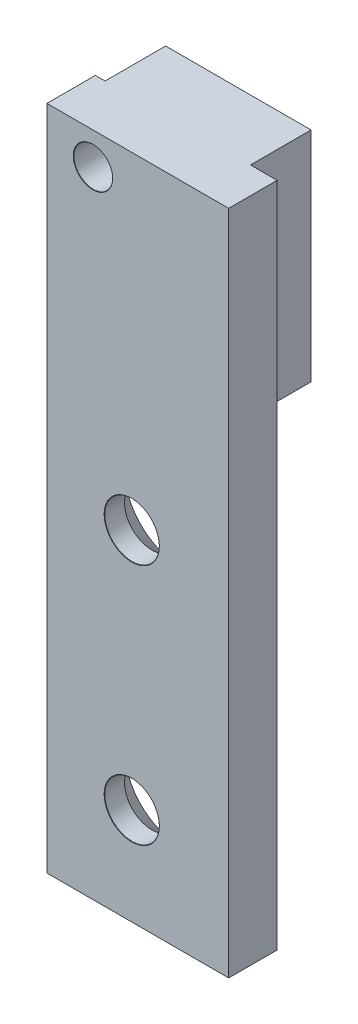
ISO-10303-21;
HEADER;
FILE_DESCRIPTION(('STEP AP214'),'2;1');
FILE_NAME('part.step','',(''),(''),'','','');
FILE_SCHEMA(('AUTOMOTIVE_DESIGN { 1 0 10303 214 1 1 1 1 }'));
ENDSEC;
DATA;
#1=APPLICATION_CONTEXT('core data for automotive mechanical design processes');
#2=APPLICATION_PROTOCOL_DEFINITION('international standard','automotive_design',2000,#1);
#3=PRODUCT_CONTEXT('',#1,'mechanical');
#4=PRODUCT('Part','Part','',(#3));
#5=PRODUCT_RELATED_PRODUCT_CATEGORY('part','',(#4));
#6=PRODUCT_DEFINITION_FORMATION('','',#4);
#7=PRODUCT_DEFINITION_CONTEXT('part definition',#1,'design');
#8=PRODUCT_DEFINITION('design','',#6,#7);
#9=PRODUCT_DEFINITION_SHAPE('','',#8);
#10=(LENGTH_UNIT() NAMED_UNIT(*) SI_UNIT(.MILLI.,.METRE.));
#11=(NAMED_UNIT(*) PLANE_ANGLE_UNIT() SI_UNIT($,.RADIAN.));
#12=(NAMED_UNIT(*) SI_UNIT($,.STERADIAN.) SOLID_ANGLE_UNIT());
#13=UNCERTAINTY_MEASURE_WITH_UNIT(LENGTH_MEASURE(1.E-05),#10,'distance_accuracy_value','');
#14=(GEOMETRIC_REPRESENTATION_CONTEXT(3) GLOBAL_UNCERTAINTY_ASSIGNED_CONTEXT((#13)) GLOBAL_UNIT_ASSIGNED_CONTEXT((#10,
#11,#12)) REPRESENTATION_CONTEXT('',''));
#15=CARTESIAN_POINT('',(0.,0.,0.));
#16=DIRECTION('',(0.,0.,1.));
#17=DIRECTION('',(1.,0.,0.));
#18=AXIS2_PLACEMENT_3D('',#15,#16,#17);
#19=CARTESIAN_POINT('',(0.,0.,0.));
#20=DIRECTION('',(0.,0.,1.));
#21=DIRECTION('',(1.,0.,0.));
#22=AXIS2_PLACEMENT_3D('',#19,#20,#21);
#23=PLANE('',#22);
#24=CARTESIAN_POINT('',(-0.5,-19.5,0.));
#25=DIRECTION('',(0.,0.,-1.));
#26=DIRECTION('',(-1.,0.,0.));
#27=AXIS2_PLACEMENT_3D('',#24,#25,#26);
#28=CIRCLE('',#27,4.59);
#29=CARTESIAN_POINT('',(-5.09,-19.5,0.));
#30=VERTEX_POINT('',#29);
#31=EDGE_CURVE('E144',#30,#30,#28,.T.);
#32=ORIENTED_EDGE('',*,*,#31,.F.);
#33=EDGE_LOOP('',(#32));
#34=FACE_BOUND('',#33,.T.);
#35=CARTESIAN_POINT('',(-0.5,0.499999999999997,0.));
#36=DIRECTION('',(0.,0.,-1.));
#37=DIRECTION('',(-1.,0.,0.));
#38=AXIS2_PLACEMENT_3D('',#35,#36,#37);
#39=CIRCLE('',#38,4.59);
#40=CARTESIAN_POINT('',(-5.09,0.499999999999997,0.));
#41=VERTEX_POINT('',#40);
#42=EDGE_CURVE('E127',#41,#41,#39,.T.);
#43=ORIENTED_EDGE('',*,*,#42,.F.);
#44=EDGE_LOOP('',(#43));
#45=FACE_BOUND('',#44,.T.);
#46=DIRECTION('',(0.,-1.,0.));
#47=VECTOR('',#46,1.);
#48=CARTESIAN_POINT('',(5.3,27.5,0.));
#49=LINE('',#48,#47);
#50=CARTESIAN_POINT('',(5.3,27.5,0.));
#51=VERTEX_POINT('',#50);
#52=CARTESIAN_POINT('',(5.3,9.5,0.));
#53=VERTEX_POINT('',#52);
#54=EDGE_CURVE('E123',#51,#53,#49,.T.);
#55=ORIENTED_EDGE('',*,*,#54,.F.);
#56=DIRECTION('',(-1.,0.,0.));
#57=VECTOR('',#56,1.);
#58=CARTESIAN_POINT('',(7.5,27.5,0.));
#59=LINE('',#58,#57);
#60=CARTESIAN_POINT('',(7.5,27.5,0.));
#61=VERTEX_POINT('',#60);
#62=EDGE_CURVE('E158',#61,#51,#59,.T.);
#63=ORIENTED_EDGE('',*,*,#62,.F.);
#64=DIRECTION('',(0.,1.,0.));
#65=VECTOR('',#64,1.);
#66=CARTESIAN_POINT('',(7.5,-27.5,0.));
#67=LINE('',#66,#65);
#68=CARTESIAN_POINT('',(7.5,-27.5,0.));
#69=VERTEX_POINT('',#68);
#70=EDGE_CURVE('E169',#69,#61,#67,.T.);
#71=ORIENTED_EDGE('',*,*,#70,.F.);
#72=DIRECTION('',(1.,0.,0.));
#73=VECTOR('',#72,1.);
#74=CARTESIAN_POINT('',(7.5,-27.5,0.));
#75=LINE('',#74,#73);
#76=CARTESIAN_POINT('',(-7.5,-27.5,0.));
#77=VERTEX_POINT('',#76);
#78=EDGE_CURVE('E167',#77,#69,#75,.T.);
#79=ORIENTED_EDGE('',*,*,#78,.F.);
#80=DIRECTION('',(0.,-1.,0.));
#81=VECTOR('',#80,1.);
#82=CARTESIAN_POINT('',(-7.5,-27.5,0.));
#83=LINE('',#82,#81);
#84=CARTESIAN_POINT('',(-7.5,27.5,0.));
#85=VERTEX_POINT('',#84);
#86=EDGE_CURVE('E153',#85,#77,#83,.T.);
#87=ORIENTED_EDGE('',*,*,#86,.F.);
#88=CARTESIAN_POINT('',(-6.7,27.5,0.));
#89=VERTEX_POINT('',#88);
#90=EDGE_CURVE('E58',#89,#85,#59,.T.);
#91=ORIENTED_EDGE('',*,*,#90,.F.);
#92=DIRECTION('',(0.,1.,0.));
#93=VECTOR('',#92,1.);
#94=CARTESIAN_POINT('',(-6.7,27.5,0.));
#95=LINE('',#94,#93);
#96=CARTESIAN_POINT('',(-6.7,9.5,0.));
#97=VERTEX_POINT('',#96);
#98=EDGE_CURVE('E120',#97,#89,#95,.T.);
#99=ORIENTED_EDGE('',*,*,#98,.F.);
#100=DIRECTION('',(-1.,0.,0.));
#101=VECTOR('',#100,1.);
#102=CARTESIAN_POINT('',(5.3,9.5,0.));
#103=LINE('',#102,#101);
#104=EDGE_CURVE('E52',#53,#97,#103,.T.);
#105=ORIENTED_EDGE('',*,*,#104,.F.);
#106=EDGE_LOOP('',(#55,#63,#71,#79,#87,#91,#99,#105));
#107=FACE_BOUND('',#106,.T.);
#108=ADVANCED_FACE('F37',(#34,#45,#107),#23,.F.);
#109=CARTESIAN_POINT('',(-7.5,-27.5,4.));
#110=DIRECTION('',(1.,0.,0.));
#111=DIRECTION('',(0.,0.,-1.));
#112=AXIS2_PLACEMENT_3D('',#109,#110,#111);
#113=PLANE('',#112);
#114=ORIENTED_EDGE('',*,*,#86,.T.);
#115=DIRECTION('',(0.,0.,-1.));
#116=VECTOR('',#115,1.);
#117=CARTESIAN_POINT('',(-7.5,-27.5,4.));
#118=LINE('',#117,#116);
#119=CARTESIAN_POINT('',(-7.5,-27.5,4.));
#120=VERTEX_POINT('',#119);
#121=EDGE_CURVE('E11',#120,#77,#118,.T.);
#122=ORIENTED_EDGE('',*,*,#121,.F.);
#123=DIRECTION('',(0.,-1.,0.));
#124=VECTOR('',#123,1.);
#125=CARTESIAN_POINT('',(-7.5,-27.5,4.));
#126=LINE('',#125,#124);
#127=CARTESIAN_POINT('',(-7.5,27.5,4.));
#128=VERTEX_POINT('',#127);
#129=EDGE_CURVE('E154',#128,#120,#126,.T.);
#130=ORIENTED_EDGE('',*,*,#129,.F.);
#131=DIRECTION('',(0.,0.,-1.));
#132=VECTOR('',#131,1.);
#133=CARTESIAN_POINT('',(-7.5,27.5,4.));
#134=LINE('',#133,#132);
#135=EDGE_CURVE('E164',#128,#85,#134,.T.);
#136=ORIENTED_EDGE('',*,*,#135,.T.);
#137=EDGE_LOOP('',(#114,#122,#130,#136));
#138=FACE_BOUND('',#137,.T.);
#139=ADVANCED_FACE('F39',(#138),#113,.F.);
#140=CARTESIAN_POINT('',(7.5,-27.5,4.));
#141=DIRECTION('',(0.,1.,0.));
#142=DIRECTION('',(-1.,0.,0.));
#143=AXIS2_PLACEMENT_3D('',#140,#141,#142);
#144=PLANE('',#143);
#145=ORIENTED_EDGE('',*,*,#78,.T.);
#146=DIRECTION('',(0.,0.,-1.));
#147=VECTOR('',#146,1.);
#148=CARTESIAN_POINT('',(7.5,-27.5,4.));
#149=LINE('',#148,#147);
#150=CARTESIAN_POINT('',(7.5,-27.5,4.));
#151=VERTEX_POINT('',#150);
#152=EDGE_CURVE('E45',#151,#69,#149,.T.);
#153=ORIENTED_EDGE('',*,*,#152,.F.);
#154=DIRECTION('',(1.,0.,0.));
#155=VECTOR('',#154,1.);
#156=CARTESIAN_POINT('',(7.5,-27.5,4.));
#157=LINE('',#156,#155);
#158=EDGE_CURVE('E157',#120,#151,#157,.T.);
#159=ORIENTED_EDGE('',*,*,#158,.F.);
#160=ORIENTED_EDGE('',*,*,#121,.T.);
#161=EDGE_LOOP('',(#145,#153,#159,#160));
#162=FACE_BOUND('',#161,.T.);
#163=ADVANCED_FACE('F237',(#162),#144,.F.);
#164=CARTESIAN_POINT('',(7.5,-27.5,4.));
#165=DIRECTION('',(-1.,0.,0.));
#166=DIRECTION('',(0.,0.,1.));
#167=AXIS2_PLACEMENT_3D('',#164,#165,#166);
#168=PLANE('',#167);
#169=ORIENTED_EDGE('',*,*,#70,.T.);
#170=DIRECTION('',(0.,0.,-1.));
#171=VECTOR('',#170,1.);
#172=CARTESIAN_POINT('',(7.5,27.5,4.));
#173=LINE('',#172,#171);
#174=CARTESIAN_POINT('',(7.5,27.5,4.));
#175=VERTEX_POINT('',#174);
#176=EDGE_CURVE('E175',#175,#61,#173,.T.);
#177=ORIENTED_EDGE('',*,*,#176,.F.);
#178=DIRECTION('',(0.,1.,0.));
#179=VECTOR('',#178,1.);
#180=CARTESIAN_POINT('',(7.5,-27.5,4.));
#181=LINE('',#180,#179);
#182=EDGE_CURVE('E160',#151,#175,#181,.T.);
#183=ORIENTED_EDGE('',*,*,#182,.F.);
#184=ORIENTED_EDGE('',*,*,#152,.T.);
#185=EDGE_LOOP('',(#169,#177,#183,#184));
#186=FACE_BOUND('',#185,.T.);
#187=ADVANCED_FACE('F182',(#186),#168,.F.);
#188=CARTESIAN_POINT('',(7.5,27.5,4.));
#189=DIRECTION('',(0.,-1.,0.));
#190=DIRECTION('',(0.,0.,-1.));
#191=AXIS2_PLACEMENT_3D('',#188,#189,#190);
#192=PLANE('',#191);
#193=ORIENTED_EDGE('',*,*,#62,.T.);
#194=DIRECTION('',(0.,0.,1.));
#195=VECTOR('',#194,1.);
#196=CARTESIAN_POINT('',(5.3,27.5,-5.));
#197=LINE('',#196,#195);
#198=CARTESIAN_POINT('',(5.3,27.5,-5.));
#199=VERTEX_POINT('',#198);
#200=EDGE_CURVE('E188',#199,#51,#197,.T.);
#201=ORIENTED_EDGE('',*,*,#200,.F.);
#202=DIRECTION('',(1.,0.,0.));
#203=VECTOR('',#202,1.);
#204=CARTESIAN_POINT('',(5.3,27.5,-5.));
#205=LINE('',#204,#203);
#206=CARTESIAN_POINT('',(-6.7,27.5,-5.));
#207=VERTEX_POINT('',#206);
#208=EDGE_CURVE('E116',#207,#199,#205,.T.);
#209=ORIENTED_EDGE('',*,*,#208,.F.);
#210=DIRECTION('',(0.,0.,1.));
#211=VECTOR('',#210,1.);
#212=CARTESIAN_POINT('',(-6.7,27.5,-5.));
#213=LINE('',#212,#211);
#214=EDGE_CURVE('E129',#207,#89,#213,.T.);
#215=ORIENTED_EDGE('',*,*,#214,.T.);
#216=ORIENTED_EDGE('',*,*,#90,.T.);
#217=ORIENTED_EDGE('',*,*,#135,.F.);
#218=DIRECTION('',(-1.,0.,0.));
#219=VECTOR('',#218,1.);
#220=CARTESIAN_POINT('',(7.5,27.5,4.));
#221=LINE('',#220,#219);
#222=EDGE_CURVE('E162',#175,#128,#221,.T.);
#223=ORIENTED_EDGE('',*,*,#222,.F.);
#224=ORIENTED_EDGE('',*,*,#176,.T.);
#225=EDGE_LOOP('',(#193,#201,#209,#215,#216,#217,#223,#224));
#226=FACE_BOUND('',#225,.T.);
#227=ADVANCED_FACE('F187',(#226),#192,.F.);
#228=CARTESIAN_POINT('',(0.,0.,4.));
#229=DIRECTION('',(0.,0.,1.));
#230=DIRECTION('',(1.,0.,0.));
#231=AXIS2_PLACEMENT_3D('',#228,#229,#230);
#232=PLANE('',#231);
#233=CARTESIAN_POINT('',(-3.7,24.85,4.));
#234=DIRECTION('',(0.,0.,-1.));
#235=DIRECTION('',(-1.,0.,0.));
#236=AXIS2_PLACEMENT_3D('',#233,#234,#235);
#237=CIRCLE('',#236,1.625);
#238=CARTESIAN_POINT('',(-5.325,24.85,4.));
#239=VERTEX_POINT('',#238);
#240=EDGE_CURVE('E204',#239,#239,#237,.T.);
#241=ORIENTED_EDGE('',*,*,#240,.T.);
#242=EDGE_LOOP('',(#241));
#243=FACE_BOUND('',#242,.T.);
#244=CARTESIAN_POINT('',(-0.5,0.499999999999997,4.));
#245=DIRECTION('',(0.,0.,-1.));
#246=DIRECTION('',(-1.,0.,0.));
#247=AXIS2_PLACEMENT_3D('',#244,#245,#246);
#248=CIRCLE('',#247,2.275);
#249=CARTESIAN_POINT('',(-2.775,0.499999999999997,4.));
#250=VERTEX_POINT('',#249);
#251=EDGE_CURVE('E124',#250,#250,#248,.T.);
#252=ORIENTED_EDGE('',*,*,#251,.T.);
#253=EDGE_LOOP('',(#252));
#254=FACE_BOUND('',#253,.T.);
#255=CARTESIAN_POINT('',(-0.5,-19.5,4.));
#256=DIRECTION('',(0.,0.,-1.));
#257=DIRECTION('',(-1.,0.,0.));
#258=AXIS2_PLACEMENT_3D('',#255,#256,#257);
#259=CIRCLE('',#258,2.275);
#260=CARTESIAN_POINT('',(-2.775,-19.5,4.));
#261=VERTEX_POINT('',#260);
#262=EDGE_CURVE('E141',#261,#261,#259,.T.);
#263=ORIENTED_EDGE('',*,*,#262,.T.);
#264=EDGE_LOOP('',(#263));
#265=FACE_BOUND('',#264,.T.);
#266=ORIENTED_EDGE('',*,*,#129,.T.);
#267=ORIENTED_EDGE('',*,*,#158,.T.);
#268=ORIENTED_EDGE('',*,*,#182,.T.);
#269=ORIENTED_EDGE('',*,*,#222,.T.);
#270=EDGE_LOOP('',(#266,#267,#268,#269));
#271=FACE_BOUND('',#270,.T.);
#272=ADVANCED_FACE('F208',(#243,#254,#265,#271),#232,.T.);
#273=CARTESIAN_POINT('',(-0.5,-19.5,3.975));
#274=DIRECTION('',(0.,0.,1.));
#275=DIRECTION('',(1.,0.,0.));
#276=AXIS2_PLACEMENT_3D('',#273,#274,#275);
#277=CONICAL_SURFACE('',#276,2.25,0.785398163397448);
#278=ORIENTED_EDGE('',*,*,#262,.F.);
#279=EDGE_LOOP('',(#278));
#280=FACE_BOUND('',#279,.T.);
#281=CARTESIAN_POINT('',(-0.5,-19.5,3.975));
#282=DIRECTION('',(0.,0.,-1.));
#283=DIRECTION('',(-1.,0.,0.));
#284=AXIS2_PLACEMENT_3D('',#281,#282,#283);
#285=CIRCLE('',#284,2.25);
#286=CARTESIAN_POINT('',(-2.75,-19.5,3.975));
#287=VERTEX_POINT('',#286);
#288=EDGE_CURVE('E150',#287,#287,#285,.T.);
#289=ORIENTED_EDGE('',*,*,#288,.T.);
#290=EDGE_LOOP('',(#289));
#291=FACE_BOUND('',#290,.T.);
#292=ADVANCED_FACE('F256',(#280,#291),#277,.F.);
#293=CARTESIAN_POINT('',(-0.5,-19.5,0.));
#294=DIRECTION('',(0.,0.,-1.));
#295=DIRECTION('',(-1.,0.,0.));
#296=AXIS2_PLACEMENT_3D('',#293,#294,#295);
#297=CYLINDRICAL_SURFACE('',#296,2.25);
#298=ORIENTED_EDGE('',*,*,#288,.F.);
#299=EDGE_LOOP('',(#298));
#300=FACE_BOUND('',#299,.T.);
#301=CARTESIAN_POINT('',(-0.5,-19.5,2.34));
#302=DIRECTION('',(0.,0.,-1.));
#303=DIRECTION('',(-1.,0.,0.));
#304=AXIS2_PLACEMENT_3D('',#301,#302,#303);
#305=CIRCLE('',#304,2.25);
#306=CARTESIAN_POINT('',(-2.75,-19.5,2.34));
#307=VERTEX_POINT('',#306);
#308=EDGE_CURVE('E147',#307,#307,#305,.T.);
#309=ORIENTED_EDGE('',*,*,#308,.T.);
#310=EDGE_LOOP('',(#309));
#311=FACE_BOUND('',#310,.T.);
#312=ADVANCED_FACE('F260',(#300,#311),#297,.F.);
#313=CARTESIAN_POINT('',(-0.5,-19.5,0.));
#314=DIRECTION('',(0.,0.,-1.));
#315=DIRECTION('',(-1.,0.,0.));
#316=AXIS2_PLACEMENT_3D('',#313,#314,#315);
#317=CONICAL_SURFACE('',#316,4.59,0.785398163397449);
#318=ORIENTED_EDGE('',*,*,#308,.F.);
#319=EDGE_LOOP('',(#318));
#320=FACE_BOUND('',#319,.T.);
#321=ORIENTED_EDGE('',*,*,#31,.T.);
#322=EDGE_LOOP('',(#321));
#323=FACE_BOUND('',#322,.T.);
#324=ADVANCED_FACE('F265',(#320,#323),#317,.F.);
#325=CARTESIAN_POINT('',(-0.5,0.499999999999997,3.975));
#326=DIRECTION('',(0.,0.,1.));
#327=DIRECTION('',(1.,0.,0.));
#328=AXIS2_PLACEMENT_3D('',#325,#326,#327);
#329=CONICAL_SURFACE('',#328,2.25,0.785398163397448);
#330=ORIENTED_EDGE('',*,*,#251,.F.);
#331=EDGE_LOOP('',(#330));
#332=FACE_BOUND('',#331,.T.);
#333=CARTESIAN_POINT('',(-0.5,0.499999999999997,3.975));
#334=DIRECTION('',(0.,0.,-1.));
#335=DIRECTION('',(-1.,0.,0.));
#336=AXIS2_PLACEMENT_3D('',#333,#334,#335);
#337=CIRCLE('',#336,2.25);
#338=CARTESIAN_POINT('',(-2.75,0.499999999999997,3.975));
#339=VERTEX_POINT('',#338);
#340=EDGE_CURVE('E138',#339,#339,#337,.T.);
#341=ORIENTED_EDGE('',*,*,#340,.T.);
#342=EDGE_LOOP('',(#341));
#343=FACE_BOUND('',#342,.T.);
#344=ADVANCED_FACE('F273',(#332,#343),#329,.F.);
#345=CARTESIAN_POINT('',(-0.5,0.499999999999997,0.));
#346=DIRECTION('',(0.,0.,-1.));
#347=DIRECTION('',(-1.,0.,0.));
#348=AXIS2_PLACEMENT_3D('',#345,#346,#347);
#349=CYLINDRICAL_SURFACE('',#348,2.25);
#350=ORIENTED_EDGE('',*,*,#340,.F.);
#351=EDGE_LOOP('',(#350));
#352=FACE_BOUND('',#351,.T.);
#353=CARTESIAN_POINT('',(-0.5,0.499999999999997,2.34));
#354=DIRECTION('',(0.,0.,-1.));
#355=DIRECTION('',(-1.,0.,0.));
#356=AXIS2_PLACEMENT_3D('',#353,#354,#355);
#357=CIRCLE('',#356,2.25);
#358=CARTESIAN_POINT('',(-2.75,0.499999999999997,2.34));
#359=VERTEX_POINT('',#358);
#360=EDGE_CURVE('E135',#359,#359,#357,.T.);
#361=ORIENTED_EDGE('',*,*,#360,.T.);
#362=EDGE_LOOP('',(#361));
#363=FACE_BOUND('',#362,.T.);
#364=ADVANCED_FACE('F277',(#352,#363),#349,.F.);
#365=CARTESIAN_POINT('',(-0.5,0.499999999999997,0.));
#366=DIRECTION('',(0.,0.,-1.));
#367=DIRECTION('',(-1.,0.,0.));
#368=AXIS2_PLACEMENT_3D('',#365,#366,#367);
#369=CONICAL_SURFACE('',#368,4.59,0.785398163397449);
#370=ORIENTED_EDGE('',*,*,#360,.F.);
#371=EDGE_LOOP('',(#370));
#372=FACE_BOUND('',#371,.T.);
#373=ORIENTED_EDGE('',*,*,#42,.T.);
#374=EDGE_LOOP('',(#373));
#375=FACE_BOUND('',#374,.T.);
#376=ADVANCED_FACE('F281',(#372,#375),#369,.F.);
#377=CARTESIAN_POINT('',(5.3,27.5,-5.));
#378=DIRECTION('',(-1.,0.,0.));
#379=DIRECTION('',(0.,-1.,0.));
#380=AXIS2_PLACEMENT_3D('',#377,#378,#379);
#381=PLANE('',#380);
#382=ORIENTED_EDGE('',*,*,#54,.T.);
#383=DIRECTION('',(0.,0.,1.));
#384=VECTOR('',#383,1.);
#385=CARTESIAN_POINT('',(5.3,9.5,-5.));
#386=LINE('',#385,#384);
#387=CARTESIAN_POINT('',(5.3,9.5,-5.));
#388=VERTEX_POINT('',#387);
#389=EDGE_CURVE('E104',#388,#53,#386,.T.);
#390=ORIENTED_EDGE('',*,*,#389,.F.);
#391=DIRECTION('',(0.,-1.,0.));
#392=VECTOR('',#391,1.);
#393=CARTESIAN_POINT('',(5.3,27.5,-5.));
#394=LINE('',#393,#392);
#395=EDGE_CURVE('E111',#199,#388,#394,.T.);
#396=ORIENTED_EDGE('',*,*,#395,.F.);
#397=ORIENTED_EDGE('',*,*,#200,.T.);
#398=EDGE_LOOP('',(#382,#390,#396,#397));
#399=FACE_BOUND('',#398,.T.);
#400=ADVANCED_FACE('F122',(#399),#381,.F.);
#401=CARTESIAN_POINT('',(5.3,9.5,-5.));
#402=DIRECTION('',(0.,1.,0.));
#403=DIRECTION('',(0.,0.,1.));
#404=AXIS2_PLACEMENT_3D('',#401,#402,#403);
#405=PLANE('',#404);
#406=ORIENTED_EDGE('',*,*,#104,.T.);
#407=DIRECTION('',(0.,0.,1.));
#408=VECTOR('',#407,1.);
#409=CARTESIAN_POINT('',(-6.7,9.5,-5.));
#410=LINE('',#409,#408);
#411=CARTESIAN_POINT('',(-6.7,9.5,-5.));
#412=VERTEX_POINT('',#411);
#413=EDGE_CURVE('E107',#412,#97,#410,.T.);
#414=ORIENTED_EDGE('',*,*,#413,.F.);
#415=DIRECTION('',(-1.,0.,0.));
#416=VECTOR('',#415,1.);
#417=CARTESIAN_POINT('',(5.3,9.5,-5.));
#418=LINE('',#417,#416);
#419=EDGE_CURVE('E100',#388,#412,#418,.T.);
#420=ORIENTED_EDGE('',*,*,#419,.F.);
#421=ORIENTED_EDGE('',*,*,#389,.T.);
#422=EDGE_LOOP('',(#406,#414,#420,#421));
#423=FACE_BOUND('',#422,.T.);
#424=ADVANCED_FACE('F102',(#423),#405,.F.);
#425=CARTESIAN_POINT('',(-6.7,27.5,-5.));
#426=DIRECTION('',(1.,0.,0.));
#427=DIRECTION('',(0.,1.,0.));
#428=AXIS2_PLACEMENT_3D('',#425,#426,#427);
#429=PLANE('',#428);
#430=ORIENTED_EDGE('',*,*,#98,.T.);
#431=ORIENTED_EDGE('',*,*,#214,.F.);
#432=DIRECTION('',(0.,1.,0.));
#433=VECTOR('',#432,1.);
#434=CARTESIAN_POINT('',(-6.7,27.5,-5.));
#435=LINE('',#434,#433);
#436=EDGE_CURVE('E110',#412,#207,#435,.T.);
#437=ORIENTED_EDGE('',*,*,#436,.F.);
#438=ORIENTED_EDGE('',*,*,#413,.T.);
#439=EDGE_LOOP('',(#430,#431,#437,#438));
#440=FACE_BOUND('',#439,.T.);
#441=ADVANCED_FACE('F224',(#440),#429,.F.);
#442=CARTESIAN_POINT('',(0.,0.,-5.));
#443=DIRECTION('',(0.,0.,-1.));
#444=DIRECTION('',(-1.,0.,0.));
#445=AXIS2_PLACEMENT_3D('',#442,#443,#444);
#446=PLANE('',#445);
#447=CARTESIAN_POINT('',(-3.7,24.85,-5.));
#448=DIRECTION('',(0.,0.,-1.));
#449=DIRECTION('',(-1.,0.,0.));
#450=AXIS2_PLACEMENT_3D('',#447,#448,#449);
#451=CIRCLE('',#450,1.6);
#452=CARTESIAN_POINT('',(-5.3,24.85,-5.));
#453=VERTEX_POINT('',#452);
#454=EDGE_CURVE('E201',#453,#453,#451,.T.);
#455=ORIENTED_EDGE('',*,*,#454,.F.);
#456=EDGE_LOOP('',(#455));
#457=FACE_BOUND('',#456,.T.);
#458=ORIENTED_EDGE('',*,*,#395,.T.);
#459=ORIENTED_EDGE('',*,*,#419,.T.);
#460=ORIENTED_EDGE('',*,*,#436,.T.);
#461=ORIENTED_EDGE('',*,*,#208,.T.);
#462=EDGE_LOOP('',(#458,#459,#460,#461));
#463=FACE_BOUND('',#462,.T.);
#464=ADVANCED_FACE('F114',(#457,#463),#446,.T.);
#465=CARTESIAN_POINT('',(-3.7,24.85,3.975));
#466=DIRECTION('',(0.,0.,1.));
#467=DIRECTION('',(1.,0.,0.));
#468=AXIS2_PLACEMENT_3D('',#465,#466,#467);
#469=CONICAL_SURFACE('',#468,1.6,0.785398163397422);
#470=ORIENTED_EDGE('',*,*,#240,.F.);
#471=EDGE_LOOP('',(#470));
#472=FACE_BOUND('',#471,.T.);
#473=CARTESIAN_POINT('',(-3.7,24.85,3.975));
#474=DIRECTION('',(0.,0.,-1.));
#475=DIRECTION('',(-1.,0.,0.));
#476=AXIS2_PLACEMENT_3D('',#473,#474,#475);
#477=CIRCLE('',#476,1.6);
#478=CARTESIAN_POINT('',(-5.3,24.85,3.975));
#479=VERTEX_POINT('',#478);
#480=EDGE_CURVE('E196',#479,#479,#477,.T.);
#481=ORIENTED_EDGE('',*,*,#480,.T.);
#482=EDGE_LOOP('',(#481));
#483=FACE_BOUND('',#482,.T.);
#484=ADVANCED_FACE('F211',(#472,#483),#469,.F.);
#485=CARTESIAN_POINT('',(-3.7,24.85,-5.));
#486=DIRECTION('',(0.,0.,-1.));
#487=DIRECTION('',(-1.,0.,0.));
#488=AXIS2_PLACEMENT_3D('',#485,#486,#487);
#489=CYLINDRICAL_SURFACE('',#488,1.6);
#490=ORIENTED_EDGE('',*,*,#480,.F.);
#491=EDGE_LOOP('',(#490));
#492=FACE_BOUND('',#491,.T.);
#493=ORIENTED_EDGE('',*,*,#454,.T.);
#494=EDGE_LOOP('',(#493));
#495=FACE_BOUND('',#494,.T.);
#496=ADVANCED_FACE('F214',(#492,#495),#489,.F.);
#497=CLOSED_SHELL('',(#108,#139,#163,#187,#227,#272,#292,#312,#324,#344,#364,#376,#400,#424,
#441,#464,#484,#496));
#498=MANIFOLD_SOLID_BREP('B2',#497);
#499=ADVANCED_BREP_SHAPE_REPRESENTATION('',(#18,#498),#14);
#500=SHAPE_DEFINITION_REPRESENTATION(#9,#499);
ENDSEC;
END-ISO-10303-21;
